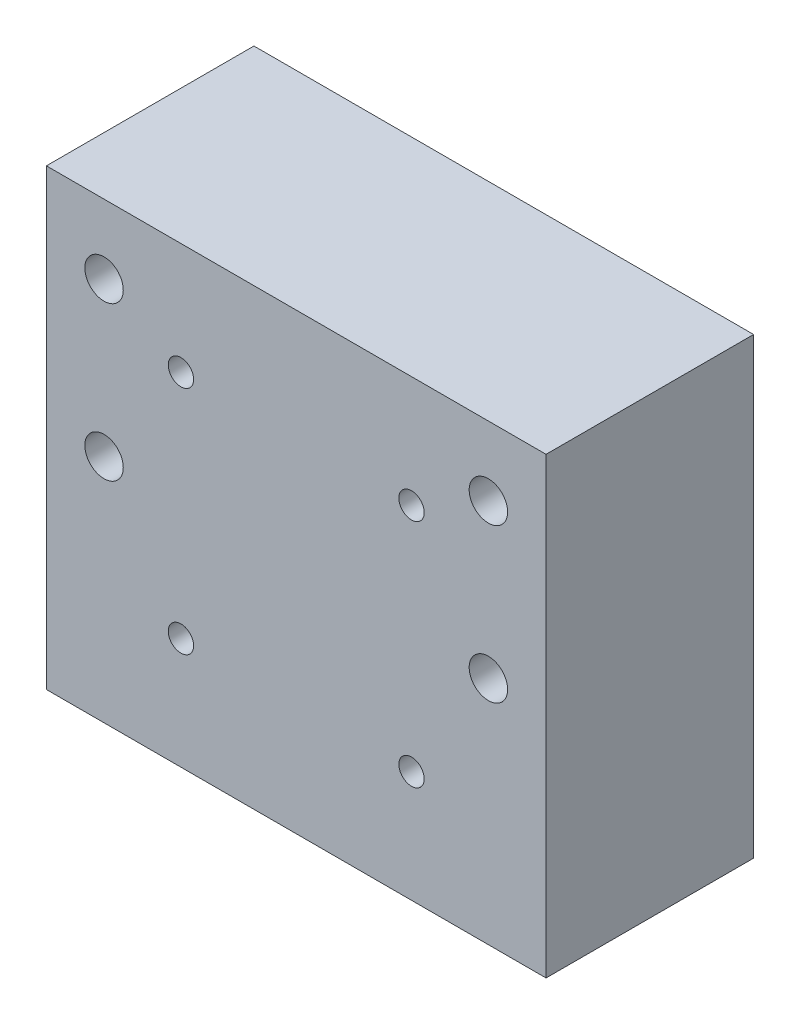
ISO-10303-21;
HEADER;
FILE_DESCRIPTION(('STEP AP214'),'2;1');
FILE_NAME('part.step','',(''),(''),'','','');
FILE_SCHEMA(('AUTOMOTIVE_DESIGN { 1 0 10303 214 1 1 1 1 }'));
ENDSEC;
DATA;
#1=APPLICATION_CONTEXT('core data for automotive mechanical design processes');
#2=APPLICATION_PROTOCOL_DEFINITION('international standard','automotive_design',2000,#1);
#3=PRODUCT_CONTEXT('',#1,'mechanical');
#4=PRODUCT('Part','Part','',(#3));
#5=PRODUCT_RELATED_PRODUCT_CATEGORY('part','',(#4));
#6=PRODUCT_DEFINITION_FORMATION('','',#4);
#7=PRODUCT_DEFINITION_CONTEXT('part definition',#1,'design');
#8=PRODUCT_DEFINITION('design','',#6,#7);
#9=PRODUCT_DEFINITION_SHAPE('','',#8);
#10=(LENGTH_UNIT() NAMED_UNIT(*) SI_UNIT(.MILLI.,.METRE.));
#11=(NAMED_UNIT(*) PLANE_ANGLE_UNIT() SI_UNIT($,.RADIAN.));
#12=(NAMED_UNIT(*) SI_UNIT($,.STERADIAN.) SOLID_ANGLE_UNIT());
#13=UNCERTAINTY_MEASURE_WITH_UNIT(LENGTH_MEASURE(1.E-05),#10,'distance_accuracy_value','');
#14=(GEOMETRIC_REPRESENTATION_CONTEXT(3) GLOBAL_UNCERTAINTY_ASSIGNED_CONTEXT((#13)) GLOBAL_UNIT_ASSIGNED_CONTEXT((#10,
#11,#12)) REPRESENTATION_CONTEXT('',''));
#15=CARTESIAN_POINT('',(0.,0.,0.));
#16=DIRECTION('',(0.,0.,1.));
#17=DIRECTION('',(1.,0.,0.));
#18=AXIS2_PLACEMENT_3D('',#15,#16,#17);
#19=CARTESIAN_POINT('',(32.5,29.5,27.));
#20=DIRECTION('',(-1.,0.,0.));
#21=DIRECTION('',(0.,0.,1.));
#22=AXIS2_PLACEMENT_3D('',#19,#20,#21);
#23=PLANE('',#22);
#24=DIRECTION('',(0.,1.,0.));
#25=VECTOR('',#24,1.);
#26=CARTESIAN_POINT('',(32.5,29.5,0.));
#27=LINE('',#26,#25);
#28=CARTESIAN_POINT('',(32.5,-29.5,0.));
#29=VERTEX_POINT('',#28);
#30=CARTESIAN_POINT('',(32.5,29.5,0.));
#31=VERTEX_POINT('',#30);
#32=EDGE_CURVE('E103',#29,#31,#27,.T.);
#33=ORIENTED_EDGE('',*,*,#32,.T.);
#34=DIRECTION('',(0.,0.,-1.));
#35=VECTOR('',#34,1.);
#36=CARTESIAN_POINT('',(32.5,29.5,27.));
#37=LINE('',#36,#35);
#38=CARTESIAN_POINT('',(32.5,29.5,27.));
#39=VERTEX_POINT('',#38);
#40=EDGE_CURVE('E94',#39,#31,#37,.T.);
#41=ORIENTED_EDGE('',*,*,#40,.F.);
#42=DIRECTION('',(0.,1.,0.));
#43=VECTOR('',#42,1.);
#44=CARTESIAN_POINT('',(32.5,29.5,27.));
#45=LINE('',#44,#43);
#46=CARTESIAN_POINT('',(32.5,-29.5,27.));
#47=VERTEX_POINT('',#46);
#48=EDGE_CURVE('E88',#47,#39,#45,.T.);
#49=ORIENTED_EDGE('',*,*,#48,.F.);
#50=DIRECTION('',(0.,0.,-1.));
#51=VECTOR('',#50,1.);
#52=CARTESIAN_POINT('',(32.5,-29.5,27.));
#53=LINE('',#52,#51);
#54=EDGE_CURVE('E99',#47,#29,#53,.T.);
#55=ORIENTED_EDGE('',*,*,#54,.T.);
#56=EDGE_LOOP('',(#33,#41,#49,#55));
#57=FACE_BOUND('',#56,.T.);
#58=ADVANCED_FACE('F34',(#57),#23,.F.);
#59=CARTESIAN_POINT('',(-32.5,29.5,27.));
#60=DIRECTION('',(0.,-1.,0.));
#61=DIRECTION('',(0.,0.,-1.));
#62=AXIS2_PLACEMENT_3D('',#59,#60,#61);
#63=PLANE('',#62);
#64=DIRECTION('',(-1.,0.,0.));
#65=VECTOR('',#64,1.);
#66=CARTESIAN_POINT('',(-32.5,29.5,0.));
#67=LINE('',#66,#65);
#68=CARTESIAN_POINT('',(-32.5,29.5,0.));
#69=VERTEX_POINT('',#68);
#70=EDGE_CURVE('E93',#31,#69,#67,.T.);
#71=ORIENTED_EDGE('',*,*,#70,.T.);
#72=DIRECTION('',(0.,0.,-1.));
#73=VECTOR('',#72,1.);
#74=CARTESIAN_POINT('',(-32.5,29.5,27.));
#75=LINE('',#74,#73);
#76=CARTESIAN_POINT('',(-32.5,29.5,27.));
#77=VERTEX_POINT('',#76);
#78=EDGE_CURVE('E91',#77,#69,#75,.T.);
#79=ORIENTED_EDGE('',*,*,#78,.F.);
#80=DIRECTION('',(-1.,0.,0.));
#81=VECTOR('',#80,1.);
#82=CARTESIAN_POINT('',(-32.5,29.5,27.));
#83=LINE('',#82,#81);
#84=EDGE_CURVE('E82',#39,#77,#83,.T.);
#85=ORIENTED_EDGE('',*,*,#84,.F.);
#86=ORIENTED_EDGE('',*,*,#40,.T.);
#87=EDGE_LOOP('',(#71,#79,#85,#86));
#88=FACE_BOUND('',#87,.T.);
#89=ADVANCED_FACE('F92',(#88),#63,.F.);
#90=CARTESIAN_POINT('',(-32.5,29.5,27.));
#91=DIRECTION('',(1.,0.,0.));
#92=DIRECTION('',(0.,0.,-1.));
#93=AXIS2_PLACEMENT_3D('',#90,#91,#92);
#94=PLANE('',#93);
#95=DIRECTION('',(0.,-1.,0.));
#96=VECTOR('',#95,1.);
#97=CARTESIAN_POINT('',(-32.5,29.5,0.));
#98=LINE('',#97,#96);
#99=CARTESIAN_POINT('',(-32.5,-29.5,0.));
#100=VERTEX_POINT('',#99);
#101=EDGE_CURVE('E68',#69,#100,#98,.T.);
#102=ORIENTED_EDGE('',*,*,#101,.T.);
#103=DIRECTION('',(0.,0.,-1.));
#104=VECTOR('',#103,1.);
#105=CARTESIAN_POINT('',(-32.5,-29.5,27.));
#106=LINE('',#105,#104);
#107=CARTESIAN_POINT('',(-32.5,-29.5,27.));
#108=VERTEX_POINT('',#107);
#109=EDGE_CURVE('E95',#108,#100,#106,.T.);
#110=ORIENTED_EDGE('',*,*,#109,.F.);
#111=DIRECTION('',(0.,-1.,0.));
#112=VECTOR('',#111,1.);
#113=CARTESIAN_POINT('',(-32.5,29.5,27.));
#114=LINE('',#113,#112);
#115=EDGE_CURVE('E86',#77,#108,#114,.T.);
#116=ORIENTED_EDGE('',*,*,#115,.F.);
#117=ORIENTED_EDGE('',*,*,#78,.T.);
#118=EDGE_LOOP('',(#102,#110,#116,#117));
#119=FACE_BOUND('',#118,.T.);
#120=ADVANCED_FACE('F97',(#119),#94,.F.);
#121=CARTESIAN_POINT('',(-32.5,-29.5,27.));
#122=DIRECTION('',(0.,1.,0.));
#123=DIRECTION('',(0.,0.,1.));
#124=AXIS2_PLACEMENT_3D('',#121,#122,#123);
#125=PLANE('',#124);
#126=DIRECTION('',(1.,0.,0.));
#127=VECTOR('',#126,1.);
#128=CARTESIAN_POINT('',(-32.5,-29.5,0.));
#129=LINE('',#128,#127);
#130=EDGE_CURVE('E74',#100,#29,#129,.T.);
#131=ORIENTED_EDGE('',*,*,#130,.T.);
#132=ORIENTED_EDGE('',*,*,#54,.F.);
#133=DIRECTION('',(1.,0.,0.));
#134=VECTOR('',#133,1.);
#135=CARTESIAN_POINT('',(-32.5,-29.5,27.));
#136=LINE('',#135,#134);
#137=EDGE_CURVE('E51',#108,#47,#136,.T.);
#138=ORIENTED_EDGE('',*,*,#137,.F.);
#139=ORIENTED_EDGE('',*,*,#109,.T.);
#140=EDGE_LOOP('',(#131,#132,#138,#139));
#141=FACE_BOUND('',#140,.T.);
#142=ADVANCED_FACE('F141',(#141),#125,.F.);
#143=CARTESIAN_POINT('',(0.,0.,27.));
#144=DIRECTION('',(0.,0.,1.));
#145=DIRECTION('',(1.,0.,0.));
#146=AXIS2_PLACEMENT_3D('',#143,#144,#145);
#147=PLANE('',#146);
#148=CARTESIAN_POINT('',(15.,15.,27.));
#149=DIRECTION('',(0.,0.,1.));
#150=DIRECTION('',(1.,0.,0.));
#151=AXIS2_PLACEMENT_3D('',#148,#149,#150);
#152=CIRCLE('',#151,1.65);
#153=CARTESIAN_POINT('',(16.65,15.,27.));
#154=VERTEX_POINT('',#153);
#155=EDGE_CURVE('E220',#154,#154,#152,.T.);
#156=ORIENTED_EDGE('',*,*,#155,.F.);
#157=EDGE_LOOP('',(#156));
#158=FACE_BOUND('',#157,.T.);
#159=CARTESIAN_POINT('',(-15.,15.,27.));
#160=DIRECTION('',(0.,0.,1.));
#161=DIRECTION('',(1.,0.,0.));
#162=AXIS2_PLACEMENT_3D('',#159,#160,#161);
#163=CIRCLE('',#162,1.65);
#164=CARTESIAN_POINT('',(-13.35,15.,27.));
#165=VERTEX_POINT('',#164);
#166=EDGE_CURVE('E217',#165,#165,#163,.T.);
#167=ORIENTED_EDGE('',*,*,#166,.F.);
#168=EDGE_LOOP('',(#167));
#169=FACE_BOUND('',#168,.T.);
#170=CARTESIAN_POINT('',(25.,20.5,27.));
#171=DIRECTION('',(0.,0.,1.));
#172=DIRECTION('',(1.,0.,0.));
#173=AXIS2_PLACEMENT_3D('',#170,#171,#172);
#174=CIRCLE('',#173,2.5);
#175=CARTESIAN_POINT('',(27.5,20.5,27.));
#176=VERTEX_POINT('',#175);
#177=EDGE_CURVE('E207',#176,#176,#174,.T.);
#178=ORIENTED_EDGE('',*,*,#177,.F.);
#179=EDGE_LOOP('',(#178));
#180=FACE_BOUND('',#179,.T.);
#181=CARTESIAN_POINT('',(-25.,20.5,27.));
#182=DIRECTION('',(0.,0.,1.));
#183=DIRECTION('',(1.,0.,0.));
#184=AXIS2_PLACEMENT_3D('',#181,#182,#183);
#185=CIRCLE('',#184,2.5);
#186=CARTESIAN_POINT('',(-22.5,20.5,27.));
#187=VERTEX_POINT('',#186);
#188=EDGE_CURVE('E205',#187,#187,#185,.T.);
#189=ORIENTED_EDGE('',*,*,#188,.F.);
#190=EDGE_LOOP('',(#189));
#191=FACE_BOUND('',#190,.T.);
#192=ORIENTED_EDGE('',*,*,#48,.T.);
#193=ORIENTED_EDGE('',*,*,#84,.T.);
#194=ORIENTED_EDGE('',*,*,#115,.T.);
#195=ORIENTED_EDGE('',*,*,#137,.T.);
#196=EDGE_LOOP('',(#192,#193,#194,#195));
#197=FACE_BOUND('',#196,.T.);
#198=CARTESIAN_POINT('',(-25.,0.499999999999997,27.));
#199=DIRECTION('',(0.,0.,1.));
#200=DIRECTION('',(1.,0.,0.));
#201=AXIS2_PLACEMENT_3D('',#198,#199,#200);
#202=CIRCLE('',#201,2.5);
#203=CARTESIAN_POINT('',(-22.5,0.499999999999997,27.));
#204=VERTEX_POINT('',#203);
#205=EDGE_CURVE('E116',#204,#204,#202,.T.);
#206=ORIENTED_EDGE('',*,*,#205,.F.);
#207=EDGE_LOOP('',(#206));
#208=FACE_BOUND('',#207,.T.);
#209=CARTESIAN_POINT('',(25.,0.499999999999997,27.));
#210=DIRECTION('',(0.,0.,1.));
#211=DIRECTION('',(1.,0.,0.));
#212=AXIS2_PLACEMENT_3D('',#209,#210,#211);
#213=CIRCLE('',#212,2.5);
#214=CARTESIAN_POINT('',(27.5,0.499999999999997,27.));
#215=VERTEX_POINT('',#214);
#216=EDGE_CURVE('E122',#215,#215,#213,.T.);
#217=ORIENTED_EDGE('',*,*,#216,.F.);
#218=EDGE_LOOP('',(#217));
#219=FACE_BOUND('',#218,.T.);
#220=CARTESIAN_POINT('',(-15.,-15.,27.));
#221=DIRECTION('',(0.,0.,1.));
#222=DIRECTION('',(1.,0.,0.));
#223=AXIS2_PLACEMENT_3D('',#220,#221,#222);
#224=CIRCLE('',#223,1.65);
#225=CARTESIAN_POINT('',(-13.35,-15.,27.));
#226=VERTEX_POINT('',#225);
#227=EDGE_CURVE('E128',#226,#226,#224,.T.);
#228=ORIENTED_EDGE('',*,*,#227,.F.);
#229=EDGE_LOOP('',(#228));
#230=FACE_BOUND('',#229,.T.);
#231=CARTESIAN_POINT('',(15.,-15.,27.));
#232=DIRECTION('',(0.,0.,1.));
#233=DIRECTION('',(1.,0.,0.));
#234=AXIS2_PLACEMENT_3D('',#231,#232,#233);
#235=CIRCLE('',#234,1.65);
#236=CARTESIAN_POINT('',(16.65,-15.,27.));
#237=VERTEX_POINT('',#236);
#238=EDGE_CURVE('E11',#237,#237,#235,.T.);
#239=ORIENTED_EDGE('',*,*,#238,.F.);
#240=EDGE_LOOP('',(#239));
#241=FACE_BOUND('',#240,.T.);
#242=ADVANCED_FACE('F83',(#158,#169,#180,#191,#197,#208,#219,#230,#241),#147,.T.);
#243=CARTESIAN_POINT('',(0.,0.,0.));
#244=DIRECTION('',(0.,0.,1.));
#245=DIRECTION('',(1.,0.,0.));
#246=AXIS2_PLACEMENT_3D('',#243,#244,#245);
#247=PLANE('',#246);
#248=CARTESIAN_POINT('',(15.,15.,0.));
#249=DIRECTION('',(0.,0.,1.));
#250=DIRECTION('',(1.,0.,0.));
#251=AXIS2_PLACEMENT_3D('',#248,#249,#250);
#252=CIRCLE('',#251,1.65);
#253=CARTESIAN_POINT('',(16.65,15.,0.));
#254=VERTEX_POINT('',#253);
#255=EDGE_CURVE('E225',#254,#254,#252,.T.);
#256=ORIENTED_EDGE('',*,*,#255,.T.);
#257=EDGE_LOOP('',(#256));
#258=FACE_BOUND('',#257,.T.);
#259=CARTESIAN_POINT('',(-15.,15.,0.));
#260=DIRECTION('',(0.,0.,1.));
#261=DIRECTION('',(1.,0.,0.));
#262=AXIS2_PLACEMENT_3D('',#259,#260,#261);
#263=CIRCLE('',#262,1.65);
#264=CARTESIAN_POINT('',(-13.35,15.,0.));
#265=VERTEX_POINT('',#264);
#266=EDGE_CURVE('E216',#265,#265,#263,.T.);
#267=ORIENTED_EDGE('',*,*,#266,.T.);
#268=EDGE_LOOP('',(#267));
#269=FACE_BOUND('',#268,.T.);
#270=CARTESIAN_POINT('',(25.,20.5,0.));
#271=DIRECTION('',(0.,0.,1.));
#272=DIRECTION('',(1.,0.,0.));
#273=AXIS2_PLACEMENT_3D('',#270,#271,#272);
#274=CIRCLE('',#273,2.5);
#275=CARTESIAN_POINT('',(27.5,20.5,0.));
#276=VERTEX_POINT('',#275);
#277=EDGE_CURVE('E211',#276,#276,#274,.T.);
#278=ORIENTED_EDGE('',*,*,#277,.T.);
#279=EDGE_LOOP('',(#278));
#280=FACE_BOUND('',#279,.T.);
#281=CARTESIAN_POINT('',(-25.,20.5,0.));
#282=DIRECTION('',(0.,0.,1.));
#283=DIRECTION('',(1.,0.,0.));
#284=AXIS2_PLACEMENT_3D('',#281,#282,#283);
#285=CIRCLE('',#284,2.5);
#286=CARTESIAN_POINT('',(-22.5,20.5,0.));
#287=VERTEX_POINT('',#286);
#288=EDGE_CURVE('E106',#287,#287,#285,.T.);
#289=ORIENTED_EDGE('',*,*,#288,.T.);
#290=EDGE_LOOP('',(#289));
#291=FACE_BOUND('',#290,.T.);
#292=ORIENTED_EDGE('',*,*,#32,.F.);
#293=ORIENTED_EDGE('',*,*,#130,.F.);
#294=ORIENTED_EDGE('',*,*,#101,.F.);
#295=ORIENTED_EDGE('',*,*,#70,.F.);
#296=EDGE_LOOP('',(#292,#293,#294,#295));
#297=FACE_BOUND('',#296,.T.);
#298=CARTESIAN_POINT('',(-25.,0.499999999999997,0.));
#299=DIRECTION('',(0.,0.,1.));
#300=DIRECTION('',(1.,0.,0.));
#301=AXIS2_PLACEMENT_3D('',#298,#299,#300);
#302=CIRCLE('',#301,2.5);
#303=CARTESIAN_POINT('',(-22.5,0.499999999999997,0.));
#304=VERTEX_POINT('',#303);
#305=EDGE_CURVE('E113',#304,#304,#302,.T.);
#306=ORIENTED_EDGE('',*,*,#305,.T.);
#307=EDGE_LOOP('',(#306));
#308=FACE_BOUND('',#307,.T.);
#309=CARTESIAN_POINT('',(25.,0.499999999999997,0.));
#310=DIRECTION('',(0.,0.,1.));
#311=DIRECTION('',(1.,0.,0.));
#312=AXIS2_PLACEMENT_3D('',#309,#310,#311);
#313=CIRCLE('',#312,2.5);
#314=CARTESIAN_POINT('',(27.5,0.499999999999997,0.));
#315=VERTEX_POINT('',#314);
#316=EDGE_CURVE('E119',#315,#315,#313,.T.);
#317=ORIENTED_EDGE('',*,*,#316,.T.);
#318=EDGE_LOOP('',(#317));
#319=FACE_BOUND('',#318,.T.);
#320=CARTESIAN_POINT('',(-15.,-15.,0.));
#321=DIRECTION('',(0.,0.,1.));
#322=DIRECTION('',(1.,0.,0.));
#323=AXIS2_PLACEMENT_3D('',#320,#321,#322);
#324=CIRCLE('',#323,1.65);
#325=CARTESIAN_POINT('',(-13.35,-15.,0.));
#326=VERTEX_POINT('',#325);
#327=EDGE_CURVE('E125',#326,#326,#324,.T.);
#328=ORIENTED_EDGE('',*,*,#327,.T.);
#329=EDGE_LOOP('',(#328));
#330=FACE_BOUND('',#329,.T.);
#331=CARTESIAN_POINT('',(15.,-15.,0.));
#332=DIRECTION('',(0.,0.,1.));
#333=DIRECTION('',(1.,0.,0.));
#334=AXIS2_PLACEMENT_3D('',#331,#332,#333);
#335=CIRCLE('',#334,1.65);
#336=CARTESIAN_POINT('',(16.65,-15.,0.));
#337=VERTEX_POINT('',#336);
#338=EDGE_CURVE('E43',#337,#337,#335,.T.);
#339=ORIENTED_EDGE('',*,*,#338,.T.);
#340=EDGE_LOOP('',(#339));
#341=FACE_BOUND('',#340,.T.);
#342=ADVANCED_FACE('F133',(#258,#269,#280,#291,#297,#308,#319,#330,#341),#247,.F.);
#343=CARTESIAN_POINT('',(-25.,20.5,0.));
#344=DIRECTION('',(0.,0.,1.));
#345=DIRECTION('',(1.,0.,0.));
#346=AXIS2_PLACEMENT_3D('',#343,#344,#345);
#347=CYLINDRICAL_SURFACE('',#346,2.5);
#348=ORIENTED_EDGE('',*,*,#288,.F.);
#349=EDGE_LOOP('',(#348));
#350=FACE_BOUND('',#349,.T.);
#351=ORIENTED_EDGE('',*,*,#188,.T.);
#352=EDGE_LOOP('',(#351));
#353=FACE_BOUND('',#352,.T.);
#354=ADVANCED_FACE('F148',(#350,#353),#347,.F.);
#355=CARTESIAN_POINT('',(25.,20.5,0.));
#356=DIRECTION('',(0.,0.,1.));
#357=DIRECTION('',(1.,0.,0.));
#358=AXIS2_PLACEMENT_3D('',#355,#356,#357);
#359=CYLINDRICAL_SURFACE('',#358,2.5);
#360=ORIENTED_EDGE('',*,*,#277,.F.);
#361=EDGE_LOOP('',(#360));
#362=FACE_BOUND('',#361,.T.);
#363=ORIENTED_EDGE('',*,*,#177,.T.);
#364=EDGE_LOOP('',(#363));
#365=FACE_BOUND('',#364,.T.);
#366=ADVANCED_FACE('F168',(#362,#365),#359,.F.);
#367=CARTESIAN_POINT('',(-25.,0.499999999999997,0.));
#368=DIRECTION('',(0.,0.,1.));
#369=DIRECTION('',(1.,0.,0.));
#370=AXIS2_PLACEMENT_3D('',#367,#368,#369);
#371=CYLINDRICAL_SURFACE('',#370,2.5);
#372=ORIENTED_EDGE('',*,*,#305,.F.);
#373=EDGE_LOOP('',(#372));
#374=FACE_BOUND('',#373,.T.);
#375=ORIENTED_EDGE('',*,*,#205,.T.);
#376=EDGE_LOOP('',(#375));
#377=FACE_BOUND('',#376,.T.);
#378=ADVANCED_FACE('F164',(#374,#377),#371,.F.);
#379=CARTESIAN_POINT('',(25.,0.499999999999997,0.));
#380=DIRECTION('',(0.,0.,1.));
#381=DIRECTION('',(1.,0.,0.));
#382=AXIS2_PLACEMENT_3D('',#379,#380,#381);
#383=CYLINDRICAL_SURFACE('',#382,2.5);
#384=ORIENTED_EDGE('',*,*,#316,.F.);
#385=EDGE_LOOP('',(#384));
#386=FACE_BOUND('',#385,.T.);
#387=ORIENTED_EDGE('',*,*,#216,.T.);
#388=EDGE_LOOP('',(#387));
#389=FACE_BOUND('',#388,.T.);
#390=ADVANCED_FACE('F167',(#386,#389),#383,.F.);
#391=CARTESIAN_POINT('',(-15.,15.,0.));
#392=DIRECTION('',(0.,0.,1.));
#393=DIRECTION('',(1.,0.,0.));
#394=AXIS2_PLACEMENT_3D('',#391,#392,#393);
#395=CYLINDRICAL_SURFACE('',#394,1.65);
#396=ORIENTED_EDGE('',*,*,#266,.F.);
#397=EDGE_LOOP('',(#396));
#398=FACE_BOUND('',#397,.T.);
#399=ORIENTED_EDGE('',*,*,#166,.T.);
#400=EDGE_LOOP('',(#399));
#401=FACE_BOUND('',#400,.T.);
#402=ADVANCED_FACE('F171',(#398,#401),#395,.F.);
#403=CARTESIAN_POINT('',(15.,15.,0.));
#404=DIRECTION('',(0.,0.,1.));
#405=DIRECTION('',(1.,0.,0.));
#406=AXIS2_PLACEMENT_3D('',#403,#404,#405);
#407=CYLINDRICAL_SURFACE('',#406,1.65);
#408=ORIENTED_EDGE('',*,*,#255,.F.);
#409=EDGE_LOOP('',(#408));
#410=FACE_BOUND('',#409,.T.);
#411=ORIENTED_EDGE('',*,*,#155,.T.);
#412=EDGE_LOOP('',(#411));
#413=FACE_BOUND('',#412,.T.);
#414=ADVANCED_FACE('F174',(#410,#413),#407,.F.);
#415=CARTESIAN_POINT('',(-15.,-15.,0.));
#416=DIRECTION('',(0.,0.,1.));
#417=DIRECTION('',(1.,0.,0.));
#418=AXIS2_PLACEMENT_3D('',#415,#416,#417);
#419=CYLINDRICAL_SURFACE('',#418,1.65);
#420=ORIENTED_EDGE('',*,*,#327,.F.);
#421=EDGE_LOOP('',(#420));
#422=FACE_BOUND('',#421,.T.);
#423=ORIENTED_EDGE('',*,*,#227,.T.);
#424=EDGE_LOOP('',(#423));
#425=FACE_BOUND('',#424,.T.);
#426=ADVANCED_FACE('F137',(#422,#425),#419,.F.);
#427=CARTESIAN_POINT('',(15.,-15.,0.));
#428=DIRECTION('',(0.,0.,1.));
#429=DIRECTION('',(1.,0.,0.));
#430=AXIS2_PLACEMENT_3D('',#427,#428,#429);
#431=CYLINDRICAL_SURFACE('',#430,1.65);
#432=ORIENTED_EDGE('',*,*,#338,.F.);
#433=EDGE_LOOP('',(#432));
#434=FACE_BOUND('',#433,.T.);
#435=ORIENTED_EDGE('',*,*,#238,.T.);
#436=EDGE_LOOP('',(#435));
#437=FACE_BOUND('',#436,.T.);
#438=ADVANCED_FACE('F36',(#434,#437),#431,.F.);
#439=CLOSED_SHELL('',(#58,#89,#120,#142,#242,#342,#354,#366,#378,#390,#402,#414,#426,#438));
#440=MANIFOLD_SOLID_BREP('B2',#439);
#441=ADVANCED_BREP_SHAPE_REPRESENTATION('',(#18,#440),#14);
#442=SHAPE_DEFINITION_REPRESENTATION(#9,#441);
ENDSEC;
END-ISO-10303-21;
